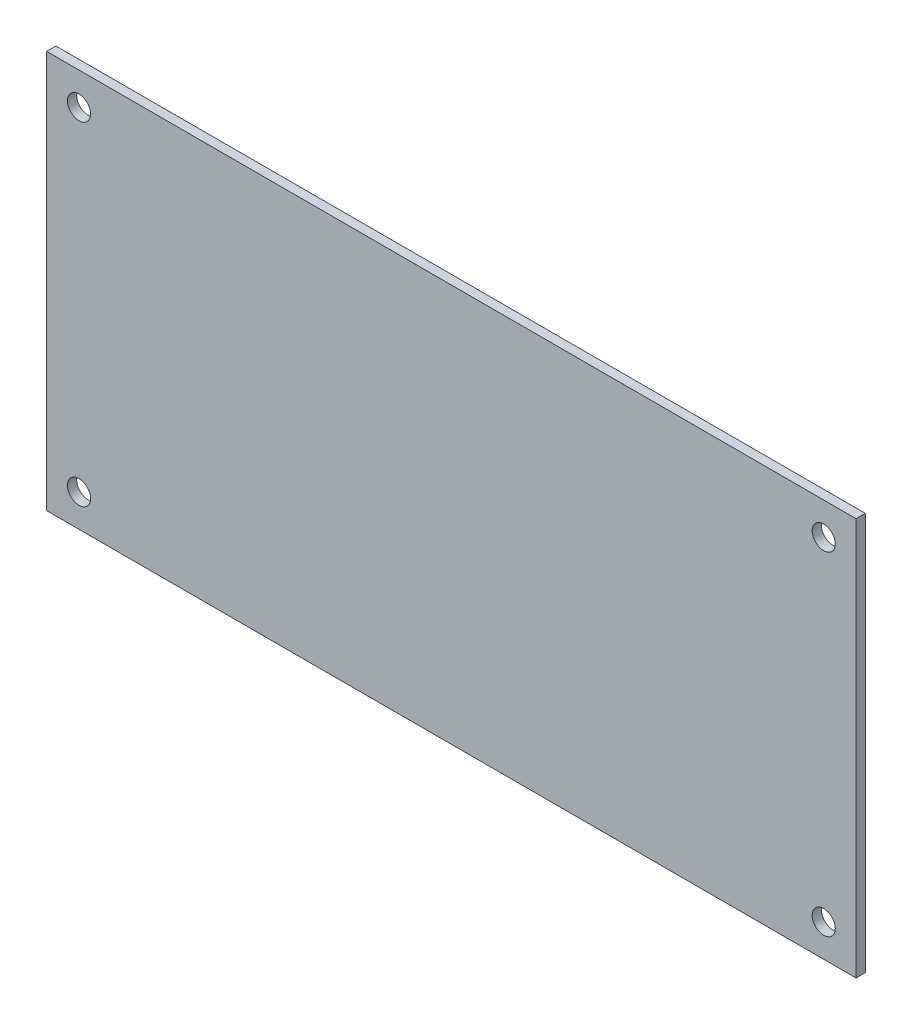
ISO-10303-21;
HEADER;
FILE_DESCRIPTION(('STEP AP214'),'2;1');
FILE_NAME('part.step','',(''),(''),'','','');
FILE_SCHEMA(('AUTOMOTIVE_DESIGN { 1 0 10303 214 1 1 1 1 }'));
ENDSEC;
DATA;
#1=APPLICATION_CONTEXT('core data for automotive mechanical design processes');
#2=APPLICATION_PROTOCOL_DEFINITION('international standard','automotive_design',2000,#1);
#3=PRODUCT_CONTEXT('',#1,'mechanical');
#4=PRODUCT('Part','Part','',(#3));
#5=PRODUCT_RELATED_PRODUCT_CATEGORY('part','',(#4));
#6=PRODUCT_DEFINITION_FORMATION('','',#4);
#7=PRODUCT_DEFINITION_CONTEXT('part definition',#1,'design');
#8=PRODUCT_DEFINITION('design','',#6,#7);
#9=PRODUCT_DEFINITION_SHAPE('','',#8);
#10=(LENGTH_UNIT() NAMED_UNIT(*) SI_UNIT(.MILLI.,.METRE.));
#11=(NAMED_UNIT(*) PLANE_ANGLE_UNIT() SI_UNIT($,.RADIAN.));
#12=(NAMED_UNIT(*) SI_UNIT($,.STERADIAN.) SOLID_ANGLE_UNIT());
#13=UNCERTAINTY_MEASURE_WITH_UNIT(LENGTH_MEASURE(1.E-05),#10,'distance_accuracy_value','');
#14=(GEOMETRIC_REPRESENTATION_CONTEXT(3) GLOBAL_UNCERTAINTY_ASSIGNED_CONTEXT((#13)) GLOBAL_UNIT_ASSIGNED_CONTEXT((#10,
#11,#12)) REPRESENTATION_CONTEXT('',''));
#15=CARTESIAN_POINT('',(0.,0.,0.));
#16=DIRECTION('',(0.,0.,1.));
#17=DIRECTION('',(1.,0.,0.));
#18=AXIS2_PLACEMENT_3D('',#15,#16,#17);
#19=CARTESIAN_POINT('',(0.,0.,2.));
#20=DIRECTION('',(0.,0.,-1.));
#21=DIRECTION('',(-1.,0.,0.));
#22=AXIS2_PLACEMENT_3D('',#19,#20,#21);
#23=PLANE('',#22);
#24=DIRECTION('',(0.,-1.,0.));
#25=VECTOR('',#24,1.);
#26=CARTESIAN_POINT('',(0.,0.,2.));
#27=LINE('',#26,#25);
#28=CARTESIAN_POINT('',(0.,86.,2.));
#29=VERTEX_POINT('',#28);
#30=CARTESIAN_POINT('',(0.,0.,2.));
#31=VERTEX_POINT('',#30);
#32=EDGE_CURVE('E92',#29,#31,#27,.T.);
#33=ORIENTED_EDGE('',*,*,#32,.T.);
#34=DIRECTION('',(1.,0.,0.));
#35=VECTOR('',#34,1.);
#36=CARTESIAN_POINT('',(0.,0.,2.));
#37=LINE('',#36,#35);
#38=CARTESIAN_POINT('',(175.,0.,2.));
#39=VERTEX_POINT('',#38);
#40=EDGE_CURVE('E87',#31,#39,#37,.T.);
#41=ORIENTED_EDGE('',*,*,#40,.T.);
#42=DIRECTION('',(0.,1.,0.));
#43=VECTOR('',#42,1.);
#44=CARTESIAN_POINT('',(175.,0.,2.));
#45=LINE('',#44,#43);
#46=CARTESIAN_POINT('',(175.,86.,2.));
#47=VERTEX_POINT('',#46);
#48=EDGE_CURVE('E90',#39,#47,#45,.T.);
#49=ORIENTED_EDGE('',*,*,#48,.T.);
#50=DIRECTION('',(-1.,0.,0.));
#51=VECTOR('',#50,1.);
#52=CARTESIAN_POINT('',(0.,86.,2.));
#53=LINE('',#52,#51);
#54=EDGE_CURVE('E57',#47,#29,#53,.T.);
#55=ORIENTED_EDGE('',*,*,#54,.T.);
#56=EDGE_LOOP('',(#33,#41,#49,#55));
#57=FACE_BOUND('',#56,.T.);
#58=CARTESIAN_POINT('',(6.99999999999998,79.,2.));
#59=DIRECTION('',(0.,0.,1.));
#60=DIRECTION('',(1.,0.,0.));
#61=AXIS2_PLACEMENT_3D('',#58,#59,#60);
#62=CIRCLE('',#61,2.5);
#63=CARTESIAN_POINT('',(9.49999999999998,79.,2.));
#64=VERTEX_POINT('',#63);
#65=EDGE_CURVE('E112',#64,#64,#62,.T.);
#66=ORIENTED_EDGE('',*,*,#65,.F.);
#67=EDGE_LOOP('',(#66));
#68=FACE_BOUND('',#67,.T.);
#69=CARTESIAN_POINT('',(168.,79.,2.));
#70=DIRECTION('',(0.,0.,1.));
#71=DIRECTION('',(1.,0.,0.));
#72=AXIS2_PLACEMENT_3D('',#69,#70,#71);
#73=CIRCLE('',#72,2.5);
#74=CARTESIAN_POINT('',(170.5,79.,2.));
#75=VERTEX_POINT('',#74);
#76=EDGE_CURVE('E134',#75,#75,#73,.T.);
#77=ORIENTED_EDGE('',*,*,#76,.F.);
#78=EDGE_LOOP('',(#77));
#79=FACE_BOUND('',#78,.T.);
#80=CARTESIAN_POINT('',(6.99999999999999,6.99999999999999,2.));
#81=DIRECTION('',(0.,0.,1.));
#82=DIRECTION('',(1.,0.,0.));
#83=AXIS2_PLACEMENT_3D('',#80,#81,#82);
#84=CIRCLE('',#83,2.5);
#85=CARTESIAN_POINT('',(9.49999999999999,6.99999999999999,2.));
#86=VERTEX_POINT('',#85);
#87=EDGE_CURVE('E142',#86,#86,#84,.T.);
#88=ORIENTED_EDGE('',*,*,#87,.F.);
#89=EDGE_LOOP('',(#88));
#90=FACE_BOUND('',#89,.T.);
#91=CARTESIAN_POINT('',(168.,6.99999999999999,2.));
#92=DIRECTION('',(0.,0.,1.));
#93=DIRECTION('',(1.,0.,0.));
#94=AXIS2_PLACEMENT_3D('',#91,#92,#93);
#95=CIRCLE('',#94,2.5);
#96=CARTESIAN_POINT('',(170.5,6.99999999999999,2.));
#97=VERTEX_POINT('',#96);
#98=EDGE_CURVE('E150',#97,#97,#95,.T.);
#99=ORIENTED_EDGE('',*,*,#98,.F.);
#100=EDGE_LOOP('',(#99));
#101=FACE_BOUND('',#100,.T.);
#102=ADVANCED_FACE('F39',(#57,#68,#79,#90,#101),#23,.F.);
#103=CARTESIAN_POINT('',(0.,0.,0.));
#104=DIRECTION('',(0.,0.,-1.));
#105=DIRECTION('',(-1.,0.,0.));
#106=AXIS2_PLACEMENT_3D('',#103,#104,#105);
#107=PLANE('',#106);
#108=CARTESIAN_POINT('',(6.99999999999999,6.99999999999999,0.));
#109=DIRECTION('',(0.,0.,1.));
#110=DIRECTION('',(1.,0.,0.));
#111=AXIS2_PLACEMENT_3D('',#108,#109,#110);
#112=CIRCLE('',#111,2.5);
#113=CARTESIAN_POINT('',(9.49999999999999,6.99999999999999,0.));
#114=VERTEX_POINT('',#113);
#115=EDGE_CURVE('E146',#114,#114,#112,.T.);
#116=ORIENTED_EDGE('',*,*,#115,.T.);
#117=EDGE_LOOP('',(#116));
#118=FACE_BOUND('',#117,.T.);
#119=CARTESIAN_POINT('',(6.99999999999998,79.,0.));
#120=DIRECTION('',(0.,0.,1.));
#121=DIRECTION('',(1.,0.,0.));
#122=AXIS2_PLACEMENT_3D('',#119,#120,#121);
#123=CIRCLE('',#122,2.5);
#124=CARTESIAN_POINT('',(9.49999999999998,79.,0.));
#125=VERTEX_POINT('',#124);
#126=EDGE_CURVE('E130',#125,#125,#123,.T.);
#127=ORIENTED_EDGE('',*,*,#126,.T.);
#128=EDGE_LOOP('',(#127));
#129=FACE_BOUND('',#128,.T.);
#130=DIRECTION('',(0.,-1.,0.));
#131=VECTOR('',#130,1.);
#132=CARTESIAN_POINT('',(0.,0.,0.));
#133=LINE('',#132,#131);
#134=CARTESIAN_POINT('',(0.,86.,0.));
#135=VERTEX_POINT('',#134);
#136=CARTESIAN_POINT('',(0.,0.,0.));
#137=VERTEX_POINT('',#136);
#138=EDGE_CURVE('E108',#135,#137,#133,.T.);
#139=ORIENTED_EDGE('',*,*,#138,.F.);
#140=DIRECTION('',(-1.,0.,0.));
#141=VECTOR('',#140,1.);
#142=CARTESIAN_POINT('',(0.,86.,0.));
#143=LINE('',#142,#141);
#144=CARTESIAN_POINT('',(175.,86.,0.));
#145=VERTEX_POINT('',#144);
#146=EDGE_CURVE('E80',#145,#135,#143,.T.);
#147=ORIENTED_EDGE('',*,*,#146,.F.);
#148=DIRECTION('',(0.,1.,0.));
#149=VECTOR('',#148,1.);
#150=CARTESIAN_POINT('',(175.,0.,0.));
#151=LINE('',#150,#149);
#152=CARTESIAN_POINT('',(175.,0.,0.));
#153=VERTEX_POINT('',#152);
#154=EDGE_CURVE('E74',#153,#145,#151,.T.);
#155=ORIENTED_EDGE('',*,*,#154,.F.);
#156=DIRECTION('',(1.,0.,0.));
#157=VECTOR('',#156,1.);
#158=CARTESIAN_POINT('',(0.,0.,0.));
#159=LINE('',#158,#157);
#160=EDGE_CURVE('E97',#137,#153,#159,.T.);
#161=ORIENTED_EDGE('',*,*,#160,.F.);
#162=EDGE_LOOP('',(#139,#147,#155,#161));
#163=FACE_BOUND('',#162,.T.);
#164=CARTESIAN_POINT('',(168.,79.,0.));
#165=DIRECTION('',(0.,0.,1.));
#166=DIRECTION('',(1.,0.,0.));
#167=AXIS2_PLACEMENT_3D('',#164,#165,#166);
#168=CIRCLE('',#167,2.5);
#169=CARTESIAN_POINT('',(170.5,79.,0.));
#170=VERTEX_POINT('',#169);
#171=EDGE_CURVE('E138',#170,#170,#168,.T.);
#172=ORIENTED_EDGE('',*,*,#171,.T.);
#173=EDGE_LOOP('',(#172));
#174=FACE_BOUND('',#173,.T.);
#175=CARTESIAN_POINT('',(168.,6.99999999999999,0.));
#176=DIRECTION('',(0.,0.,1.));
#177=DIRECTION('',(1.,0.,0.));
#178=AXIS2_PLACEMENT_3D('',#175,#176,#177);
#179=CIRCLE('',#178,2.5);
#180=CARTESIAN_POINT('',(170.5,6.99999999999999,0.));
#181=VERTEX_POINT('',#180);
#182=EDGE_CURVE('E154',#181,#181,#179,.T.);
#183=ORIENTED_EDGE('',*,*,#182,.T.);
#184=EDGE_LOOP('',(#183));
#185=FACE_BOUND('',#184,.T.);
#186=ADVANCED_FACE('F125',(#118,#129,#163,#174,#185),#107,.T.);
#187=CARTESIAN_POINT('',(0.,0.,2.));
#188=DIRECTION('',(1.,0.,0.));
#189=DIRECTION('',(0.,0.,-1.));
#190=AXIS2_PLACEMENT_3D('',#187,#188,#189);
#191=PLANE('',#190);
#192=ORIENTED_EDGE('',*,*,#138,.T.);
#193=DIRECTION('',(0.,0.,-1.));
#194=VECTOR('',#193,1.);
#195=CARTESIAN_POINT('',(0.,0.,2.));
#196=LINE('',#195,#194);
#197=EDGE_CURVE('E11',#31,#137,#196,.T.);
#198=ORIENTED_EDGE('',*,*,#197,.F.);
#199=ORIENTED_EDGE('',*,*,#32,.F.);
#200=DIRECTION('',(0.,0.,-1.));
#201=VECTOR('',#200,1.);
#202=CARTESIAN_POINT('',(0.,86.,2.));
#203=LINE('',#202,#201);
#204=EDGE_CURVE('E104',#29,#135,#203,.T.);
#205=ORIENTED_EDGE('',*,*,#204,.T.);
#206=EDGE_LOOP('',(#192,#198,#199,#205));
#207=FACE_BOUND('',#206,.T.);
#208=ADVANCED_FACE('F41',(#207),#191,.F.);
#209=CARTESIAN_POINT('',(0.,0.,2.));
#210=DIRECTION('',(0.,1.,0.));
#211=DIRECTION('',(0.,0.,1.));
#212=AXIS2_PLACEMENT_3D('',#209,#210,#211);
#213=PLANE('',#212);
#214=ORIENTED_EDGE('',*,*,#160,.T.);
#215=DIRECTION('',(0.,0.,-1.));
#216=VECTOR('',#215,1.);
#217=CARTESIAN_POINT('',(175.,0.,2.));
#218=LINE('',#217,#216);
#219=EDGE_CURVE('E49',#39,#153,#218,.T.);
#220=ORIENTED_EDGE('',*,*,#219,.F.);
#221=ORIENTED_EDGE('',*,*,#40,.F.);
#222=ORIENTED_EDGE('',*,*,#197,.T.);
#223=EDGE_LOOP('',(#214,#220,#221,#222));
#224=FACE_BOUND('',#223,.T.);
#225=ADVANCED_FACE('F96',(#224),#213,.F.);
#226=CARTESIAN_POINT('',(175.,0.,2.));
#227=DIRECTION('',(-1.,0.,0.));
#228=DIRECTION('',(0.,0.,1.));
#229=AXIS2_PLACEMENT_3D('',#226,#227,#228);
#230=PLANE('',#229);
#231=ORIENTED_EDGE('',*,*,#154,.T.);
#232=DIRECTION('',(0.,0.,-1.));
#233=VECTOR('',#232,1.);
#234=CARTESIAN_POINT('',(175.,86.,2.));
#235=LINE('',#234,#233);
#236=EDGE_CURVE('E99',#47,#145,#235,.T.);
#237=ORIENTED_EDGE('',*,*,#236,.F.);
#238=ORIENTED_EDGE('',*,*,#48,.F.);
#239=ORIENTED_EDGE('',*,*,#219,.T.);
#240=EDGE_LOOP('',(#231,#237,#238,#239));
#241=FACE_BOUND('',#240,.T.);
#242=ADVANCED_FACE('F100',(#241),#230,.F.);
#243=CARTESIAN_POINT('',(0.,86.,2.));
#244=DIRECTION('',(0.,-1.,0.));
#245=DIRECTION('',(0.,0.,-1.));
#246=AXIS2_PLACEMENT_3D('',#243,#244,#245);
#247=PLANE('',#246);
#248=ORIENTED_EDGE('',*,*,#146,.T.);
#249=ORIENTED_EDGE('',*,*,#204,.F.);
#250=ORIENTED_EDGE('',*,*,#54,.F.);
#251=ORIENTED_EDGE('',*,*,#236,.T.);
#252=EDGE_LOOP('',(#248,#249,#250,#251));
#253=FACE_BOUND('',#252,.T.);
#254=ADVANCED_FACE('F122',(#253),#247,.F.);
#255=CARTESIAN_POINT('',(6.99999999999998,79.,2.));
#256=DIRECTION('',(0.,0.,-1.));
#257=DIRECTION('',(-1.,0.,0.));
#258=AXIS2_PLACEMENT_3D('',#255,#256,#257);
#259=CYLINDRICAL_SURFACE('',#258,2.5);
#260=ORIENTED_EDGE('',*,*,#65,.T.);
#261=EDGE_LOOP('',(#260));
#262=FACE_BOUND('',#261,.T.);
#263=ORIENTED_EDGE('',*,*,#126,.F.);
#264=EDGE_LOOP('',(#263));
#265=FACE_BOUND('',#264,.T.);
#266=ADVANCED_FACE('F173',(#262,#265),#259,.F.);
#267=CARTESIAN_POINT('',(168.,79.,2.));
#268=DIRECTION('',(0.,0.,-1.));
#269=DIRECTION('',(-1.,0.,0.));
#270=AXIS2_PLACEMENT_3D('',#267,#268,#269);
#271=CYLINDRICAL_SURFACE('',#270,2.5);
#272=ORIENTED_EDGE('',*,*,#76,.T.);
#273=EDGE_LOOP('',(#272));
#274=FACE_BOUND('',#273,.T.);
#275=ORIENTED_EDGE('',*,*,#171,.F.);
#276=EDGE_LOOP('',(#275));
#277=FACE_BOUND('',#276,.T.);
#278=ADVANCED_FACE('F219',(#274,#277),#271,.F.);
#279=CARTESIAN_POINT('',(6.99999999999999,6.99999999999999,2.));
#280=DIRECTION('',(0.,0.,-1.));
#281=DIRECTION('',(-1.,0.,0.));
#282=AXIS2_PLACEMENT_3D('',#279,#280,#281);
#283=CYLINDRICAL_SURFACE('',#282,2.5);
#284=ORIENTED_EDGE('',*,*,#87,.T.);
#285=EDGE_LOOP('',(#284));
#286=FACE_BOUND('',#285,.T.);
#287=ORIENTED_EDGE('',*,*,#115,.F.);
#288=EDGE_LOOP('',(#287));
#289=FACE_BOUND('',#288,.T.);
#290=ADVANCED_FACE('F227',(#286,#289),#283,.F.);
#291=CARTESIAN_POINT('',(168.,6.99999999999999,2.));
#292=DIRECTION('',(0.,0.,-1.));
#293=DIRECTION('',(-1.,0.,0.));
#294=AXIS2_PLACEMENT_3D('',#291,#292,#293);
#295=CYLINDRICAL_SURFACE('',#294,2.5);
#296=ORIENTED_EDGE('',*,*,#98,.T.);
#297=EDGE_LOOP('',(#296));
#298=FACE_BOUND('',#297,.T.);
#299=ORIENTED_EDGE('',*,*,#182,.F.);
#300=EDGE_LOOP('',(#299));
#301=FACE_BOUND('',#300,.T.);
#302=ADVANCED_FACE('F162',(#298,#301),#295,.F.);
#303=CLOSED_SHELL('',(#102,#186,#208,#225,#242,#254,#266,#278,#290,#302));
#304=MANIFOLD_SOLID_BREP('B2',#303);
#305=ADVANCED_BREP_SHAPE_REPRESENTATION('',(#18,#304),#14);
#306=SHAPE_DEFINITION_REPRESENTATION(#9,#305);
ENDSEC;
END-ISO-10303-21;
